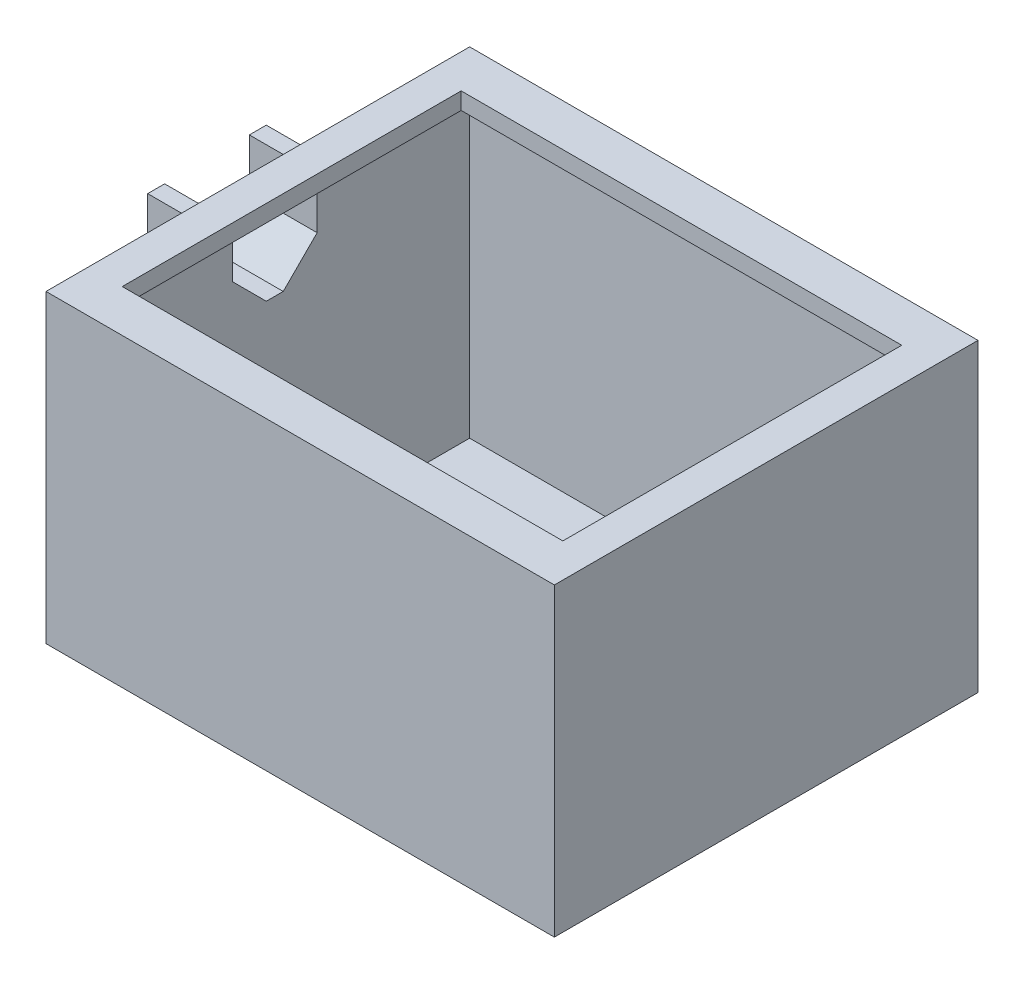
ISO-10303-21;
HEADER;
FILE_DESCRIPTION(('STEP AP214'),'2;1');
FILE_NAME('part.step','',(''),(''),'','','');
FILE_SCHEMA(('AUTOMOTIVE_DESIGN { 1 0 10303 214 1 1 1 1 }'));
ENDSEC;
DATA;
#1=APPLICATION_CONTEXT('core data for automotive mechanical design processes');
#2=APPLICATION_PROTOCOL_DEFINITION('international standard','automotive_design',2000,#1);
#3=PRODUCT_CONTEXT('',#1,'mechanical');
#4=PRODUCT('Part','Part','',(#3));
#5=PRODUCT_RELATED_PRODUCT_CATEGORY('part','',(#4));
#6=PRODUCT_DEFINITION_FORMATION('','',#4);
#7=PRODUCT_DEFINITION_CONTEXT('part definition',#1,'design');
#8=PRODUCT_DEFINITION('design','',#6,#7);
#9=PRODUCT_DEFINITION_SHAPE('','',#8);
#10=(LENGTH_UNIT() NAMED_UNIT(*) SI_UNIT(.MILLI.,.METRE.));
#11=(NAMED_UNIT(*) PLANE_ANGLE_UNIT() SI_UNIT($,.RADIAN.));
#12=(NAMED_UNIT(*) SI_UNIT($,.STERADIAN.) SOLID_ANGLE_UNIT());
#13=UNCERTAINTY_MEASURE_WITH_UNIT(LENGTH_MEASURE(1.E-05),#10,'distance_accuracy_value','');
#14=(GEOMETRIC_REPRESENTATION_CONTEXT(3) GLOBAL_UNCERTAINTY_ASSIGNED_CONTEXT((#13)) GLOBAL_UNIT_ASSIGNED_CONTEXT((#10,
#11,#12)) REPRESENTATION_CONTEXT('',''));
#15=CARTESIAN_POINT('',(0.,0.,0.));
#16=DIRECTION('',(0.,0.,1.));
#17=DIRECTION('',(1.,0.,0.));
#18=AXIS2_PLACEMENT_3D('',#15,#16,#17);
#19=CARTESIAN_POINT('',(-28.,40.,-25.));
#20=DIRECTION('',(1.,0.,0.));
#21=DIRECTION('',(0.,0.,-1.));
#22=AXIS2_PLACEMENT_3D('',#19,#20,#21);
#23=PLANE('',#22);
#24=DIRECTION('',(0.,-1.,0.));
#25=VECTOR('',#24,1.);
#26=CARTESIAN_POINT('',(-28.,40.,-4.99999999999999));
#27=LINE('',#26,#25);
#28=CARTESIAN_POINT('',(-28.,38.,-4.99999999999999));
#29=VERTEX_POINT('',#28);
#30=CARTESIAN_POINT('',(-28.,32.,-4.99999999999999));
#31=VERTEX_POINT('',#30);
#32=EDGE_CURVE('E305',#29,#31,#27,.T.);
#33=ORIENTED_EDGE('',*,*,#32,.T.);
#34=DIRECTION('',(0.,0.707106781186544,-0.707106781186552));
#35=VECTOR('',#34,1.);
#36=CARTESIAN_POINT('',(-28.,28.,-0.999999999999951));
#37=LINE('',#36,#35);
#38=CARTESIAN_POINT('',(-28.,28.,-0.999999999999952));
#39=VERTEX_POINT('',#38);
#40=EDGE_CURVE('E500',#31,#39,#37,.F.);
#41=ORIENTED_EDGE('',*,*,#40,.T.);
#42=DIRECTION('',(0.,0.,1.));
#43=VECTOR('',#42,1.);
#44=CARTESIAN_POINT('',(-28.,28.,-25.));
#45=LINE('',#44,#43);
#46=CARTESIAN_POINT('',(-28.,28.,1.));
#47=VERTEX_POINT('',#46);
#48=EDGE_CURVE('E309',#39,#47,#45,.T.);
#49=ORIENTED_EDGE('',*,*,#48,.T.);
#50=DIRECTION('',(0.,-0.707106781186553,-0.707106781186543));
#51=VECTOR('',#50,1.);
#52=CARTESIAN_POINT('',(-28.,32.0000000000001,5.));
#53=LINE('',#52,#51);
#54=CARTESIAN_POINT('',(-28.,32.0000000000001,5.));
#55=VERTEX_POINT('',#54);
#56=EDGE_CURVE('E11',#47,#55,#53,.F.);
#57=ORIENTED_EDGE('',*,*,#56,.T.);
#58=DIRECTION('',(0.,1.,0.));
#59=VECTOR('',#58,1.);
#60=CARTESIAN_POINT('',(-28.,40.,5.));
#61=LINE('',#60,#59);
#62=CARTESIAN_POINT('',(-28.,38.,5.));
#63=VERTEX_POINT('',#62);
#64=EDGE_CURVE('E312',#55,#63,#61,.T.);
#65=ORIENTED_EDGE('',*,*,#64,.T.);
#66=DIRECTION('',(0.,0.,1.));
#67=VECTOR('',#66,1.);
#68=CARTESIAN_POINT('',(-28.,38.,-25.));
#69=LINE('',#68,#67);
#70=CARTESIAN_POINT('',(-28.,38.,23.));
#71=VERTEX_POINT('',#70);
#72=EDGE_CURVE('E383',#63,#71,#69,.T.);
#73=ORIENTED_EDGE('',*,*,#72,.T.);
#74=DIRECTION('',(0.,-1.,0.));
#75=VECTOR('',#74,1.);
#76=CARTESIAN_POINT('',(-28.,40.,23.));
#77=LINE('',#76,#75);
#78=CARTESIAN_POINT('',(-28.,2.,23.));
#79=VERTEX_POINT('',#78);
#80=EDGE_CURVE('E391',#71,#79,#77,.T.);
#81=ORIENTED_EDGE('',*,*,#80,.T.);
#82=DIRECTION('',(0.,0.,1.));
#83=VECTOR('',#82,1.);
#84=CARTESIAN_POINT('',(-28.,2.,-25.));
#85=LINE('',#84,#83);
#86=CARTESIAN_POINT('',(-28.,2.,-23.));
#87=VERTEX_POINT('',#86);
#88=EDGE_CURVE('E402',#87,#79,#85,.T.);
#89=ORIENTED_EDGE('',*,*,#88,.F.);
#90=DIRECTION('',(0.,-1.,0.));
#91=VECTOR('',#90,1.);
#92=CARTESIAN_POINT('',(-28.,40.,-23.));
#93=LINE('',#92,#91);
#94=CARTESIAN_POINT('',(-28.,38.,-23.));
#95=VERTEX_POINT('',#94);
#96=EDGE_CURVE('E398',#95,#87,#93,.T.);
#97=ORIENTED_EDGE('',*,*,#96,.F.);
#98=EDGE_CURVE('E379',#95,#29,#69,.T.);
#99=ORIENTED_EDGE('',*,*,#98,.T.);
#100=EDGE_LOOP('',(#33,#41,#49,#57,#65,#73,#81,#89,#97,#99));
#101=FACE_BOUND('',#100,.T.);
#102=ADVANCED_FACE('F41',(#101),#23,.T.);
#103=CARTESIAN_POINT('',(-30.,40.,-25.));
#104=DIRECTION('',(1.,0.,0.));
#105=DIRECTION('',(0.,0.,-1.));
#106=AXIS2_PLACEMENT_3D('',#103,#104,#105);
#107=PLANE('',#106);
#108=DIRECTION('',(0.,-1.,0.));
#109=VECTOR('',#108,1.);
#110=CARTESIAN_POINT('',(-30.,40.,-25.));
#111=LINE('',#110,#109);
#112=CARTESIAN_POINT('',(-30.,40.,-25.));
#113=VERTEX_POINT('',#112);
#114=CARTESIAN_POINT('',(-30.,4.00000000000002,-25.));
#115=VERTEX_POINT('',#114);
#116=EDGE_CURVE('E366',#113,#115,#111,.T.);
#117=ORIENTED_EDGE('',*,*,#116,.T.);
#118=DIRECTION('',(0.,0.,1.));
#119=VECTOR('',#118,1.);
#120=CARTESIAN_POINT('',(-30.,4.00000000000002,-25.));
#121=LINE('',#120,#119);
#122=CARTESIAN_POINT('',(-30.,4.00000000000002,25.));
#123=VERTEX_POINT('',#122);
#124=EDGE_CURVE('E456',#115,#123,#121,.T.);
#125=ORIENTED_EDGE('',*,*,#124,.T.);
#126=DIRECTION('',(0.,-1.,0.));
#127=VECTOR('',#126,1.);
#128=CARTESIAN_POINT('',(-30.,40.,25.));
#129=LINE('',#128,#127);
#130=CARTESIAN_POINT('',(-30.,40.,25.));
#131=VERTEX_POINT('',#130);
#132=EDGE_CURVE('E362',#131,#123,#129,.T.);
#133=ORIENTED_EDGE('',*,*,#132,.F.);
#134=DIRECTION('',(0.,0.,1.));
#135=VECTOR('',#134,1.);
#136=CARTESIAN_POINT('',(-30.,40.,-25.));
#137=LINE('',#136,#135);
#138=EDGE_CURVE('E352',#113,#131,#137,.T.);
#139=ORIENTED_EDGE('',*,*,#138,.F.);
#140=EDGE_LOOP('',(#117,#125,#133,#139));
#141=FACE_BOUND('',#140,.T.);
#142=DIRECTION('',(0.,0.,-1.));
#143=VECTOR('',#142,1.);
#144=CARTESIAN_POINT('',(-30.,21.,-25.));
#145=LINE('',#144,#143);
#146=CARTESIAN_POINT('',(-30.,21.,7.00000000000001));
#147=VERTEX_POINT('',#146);
#148=CARTESIAN_POINT('',(-30.,21.,-6.99999999999999));
#149=VERTEX_POINT('',#148);
#150=EDGE_CURVE('E459',#147,#149,#145,.T.);
#151=ORIENTED_EDGE('',*,*,#150,.T.);
#152=DIRECTION('',(0.,1.,0.));
#153=VECTOR('',#152,1.);
#154=CARTESIAN_POINT('',(-30.,26.,-6.99999999999999));
#155=LINE('',#154,#153);
#156=CARTESIAN_POINT('',(-30.,38.,-6.99999999999999));
#157=VERTEX_POINT('',#156);
#158=EDGE_CURVE('E271',#149,#157,#155,.T.);
#159=ORIENTED_EDGE('',*,*,#158,.T.);
#160=DIRECTION('',(0.,0.,1.));
#161=VECTOR('',#160,1.);
#162=CARTESIAN_POINT('',(-30.,38.,-6.99999999999999));
#163=LINE('',#162,#161);
#164=CARTESIAN_POINT('',(-30.,38.,-4.99999999999999));
#165=VERTEX_POINT('',#164);
#166=EDGE_CURVE('E225',#157,#165,#163,.T.);
#167=ORIENTED_EDGE('',*,*,#166,.T.);
#168=DIRECTION('',(0.,0.,1.));
#169=VECTOR('',#168,1.);
#170=CARTESIAN_POINT('',(-30.,38.,-4.99999999999999));
#171=LINE('',#170,#169);
#172=CARTESIAN_POINT('',(-30.,38.,5.));
#173=VERTEX_POINT('',#172);
#174=EDGE_CURVE('E281',#165,#173,#171,.T.);
#175=ORIENTED_EDGE('',*,*,#174,.T.);
#176=DIRECTION('',(0.,0.,1.));
#177=VECTOR('',#176,1.);
#178=CARTESIAN_POINT('',(-30.,38.,5.));
#179=LINE('',#178,#177);
#180=CARTESIAN_POINT('',(-30.,38.,7.00000000000001));
#181=VERTEX_POINT('',#180);
#182=EDGE_CURVE('E231',#173,#181,#179,.T.);
#183=ORIENTED_EDGE('',*,*,#182,.T.);
#184=DIRECTION('',(0.,-1.,0.));
#185=VECTOR('',#184,1.);
#186=CARTESIAN_POINT('',(-30.,38.,7.00000000000001));
#187=LINE('',#186,#185);
#188=EDGE_CURVE('E268',#181,#147,#187,.T.);
#189=ORIENTED_EDGE('',*,*,#188,.T.);
#190=EDGE_LOOP('',(#151,#159,#167,#175,#183,#189));
#191=FACE_BOUND('',#190,.T.);
#192=ADVANCED_FACE('F516',(#141,#191),#107,.F.);
#193=CARTESIAN_POINT('',(28.,40.,-25.));
#194=DIRECTION('',(-1.,0.,0.));
#195=DIRECTION('',(0.,0.,1.));
#196=AXIS2_PLACEMENT_3D('',#193,#194,#195);
#197=PLANE('',#196);
#198=DIRECTION('',(0.,0.,-1.));
#199=VECTOR('',#198,1.);
#200=CARTESIAN_POINT('',(28.,2.,-25.));
#201=LINE('',#200,#199);
#202=CARTESIAN_POINT('',(28.,2.,23.));
#203=VERTEX_POINT('',#202);
#204=CARTESIAN_POINT('',(28.,2.,-23.));
#205=VERTEX_POINT('',#204);
#206=EDGE_CURVE('E374',#203,#205,#201,.T.);
#207=ORIENTED_EDGE('',*,*,#206,.F.);
#208=DIRECTION('',(0.,-1.,0.));
#209=VECTOR('',#208,1.);
#210=CARTESIAN_POINT('',(28.,40.,23.));
#211=LINE('',#210,#209);
#212=CARTESIAN_POINT('',(28.,38.,23.));
#213=VERTEX_POINT('',#212);
#214=EDGE_CURVE('E412',#213,#203,#211,.T.);
#215=ORIENTED_EDGE('',*,*,#214,.F.);
#216=DIRECTION('',(0.,0.,-1.));
#217=VECTOR('',#216,1.);
#218=CARTESIAN_POINT('',(28.,38.,-25.));
#219=LINE('',#218,#217);
#220=CARTESIAN_POINT('',(28.,38.,-23.));
#221=VERTEX_POINT('',#220);
#222=EDGE_CURVE('E387',#213,#221,#219,.T.);
#223=ORIENTED_EDGE('',*,*,#222,.T.);
#224=DIRECTION('',(0.,-1.,0.));
#225=VECTOR('',#224,1.);
#226=CARTESIAN_POINT('',(28.,40.,-23.));
#227=LINE('',#226,#225);
#228=EDGE_CURVE('E405',#221,#205,#227,.T.);
#229=ORIENTED_EDGE('',*,*,#228,.T.);
#230=EDGE_LOOP('',(#207,#215,#223,#229));
#231=FACE_BOUND('',#230,.T.);
#232=ADVANCED_FACE('F523',(#231),#197,.T.);
#233=CARTESIAN_POINT('',(-30.,40.,-23.));
#234=DIRECTION('',(0.,0.,1.));
#235=DIRECTION('',(1.,0.,0.));
#236=AXIS2_PLACEMENT_3D('',#233,#234,#235);
#237=PLANE('',#236);
#238=DIRECTION('',(-1.,0.,0.));
#239=VECTOR('',#238,1.);
#240=CARTESIAN_POINT('',(-30.,2.,-23.));
#241=LINE('',#240,#239);
#242=EDGE_CURVE('E409',#205,#87,#241,.T.);
#243=ORIENTED_EDGE('',*,*,#242,.F.);
#244=ORIENTED_EDGE('',*,*,#228,.F.);
#245=DIRECTION('',(-1.,0.,0.));
#246=VECTOR('',#245,1.);
#247=CARTESIAN_POINT('',(-30.,38.,-23.));
#248=LINE('',#247,#246);
#249=EDGE_CURVE('E384',#221,#95,#248,.T.);
#250=ORIENTED_EDGE('',*,*,#249,.T.);
#251=ORIENTED_EDGE('',*,*,#96,.T.);
#252=EDGE_LOOP('',(#243,#244,#250,#251));
#253=FACE_BOUND('',#252,.T.);
#254=ADVANCED_FACE('F528',(#253),#237,.T.);
#255=CARTESIAN_POINT('',(-30.,40.,23.));
#256=DIRECTION('',(0.,0.,-1.));
#257=DIRECTION('',(-1.,0.,0.));
#258=AXIS2_PLACEMENT_3D('',#255,#256,#257);
#259=PLANE('',#258);
#260=DIRECTION('',(1.,0.,0.));
#261=VECTOR('',#260,1.);
#262=CARTESIAN_POINT('',(-30.,2.,23.));
#263=LINE('',#262,#261);
#264=EDGE_CURVE('E395',#79,#203,#263,.T.);
#265=ORIENTED_EDGE('',*,*,#264,.F.);
#266=ORIENTED_EDGE('',*,*,#80,.F.);
#267=DIRECTION('',(1.,0.,0.));
#268=VECTOR('',#267,1.);
#269=CARTESIAN_POINT('',(-30.,38.,23.));
#270=LINE('',#269,#268);
#271=EDGE_CURVE('E375',#71,#213,#270,.T.);
#272=ORIENTED_EDGE('',*,*,#271,.T.);
#273=ORIENTED_EDGE('',*,*,#214,.T.);
#274=EDGE_LOOP('',(#265,#266,#272,#273));
#275=FACE_BOUND('',#274,.T.);
#276=ADVANCED_FACE('F530',(#275),#259,.T.);
#277=CARTESIAN_POINT('',(0.,38.,0.));
#278=DIRECTION('',(0.,1.,0.));
#279=DIRECTION('',(0.,0.,1.));
#280=AXIS2_PLACEMENT_3D('',#277,#278,#279);
#281=PLANE('',#280);
#282=ORIENTED_EDGE('',*,*,#72,.F.);
#283=DIRECTION('',(-1.,0.,0.));
#284=VECTOR('',#283,1.);
#285=CARTESIAN_POINT('',(-25.,38.,5.));
#286=LINE('',#285,#284);
#287=EDGE_CURVE('E298',#63,#173,#286,.T.);
#288=ORIENTED_EDGE('',*,*,#287,.T.);
#289=ORIENTED_EDGE('',*,*,#174,.F.);
#290=DIRECTION('',(-1.,0.,0.));
#291=VECTOR('',#290,1.);
#292=CARTESIAN_POINT('',(-25.,38.,-5.));
#293=LINE('',#292,#291);
#294=EDGE_CURVE('E301',#29,#165,#293,.T.);
#295=ORIENTED_EDGE('',*,*,#294,.F.);
#296=ORIENTED_EDGE('',*,*,#98,.F.);
#297=ORIENTED_EDGE('',*,*,#249,.F.);
#298=ORIENTED_EDGE('',*,*,#222,.F.);
#299=ORIENTED_EDGE('',*,*,#271,.F.);
#300=EDGE_LOOP('',(#282,#288,#289,#295,#296,#297,#298,#299));
#301=FACE_BOUND('',#300,.T.);
#302=DIRECTION('',(0.,0.,1.));
#303=VECTOR('',#302,1.);
#304=CARTESIAN_POINT('',(-26.,38.,0.));
#305=LINE('',#304,#303);
#306=CARTESIAN_POINT('',(-26.,38.,-20.));
#307=VERTEX_POINT('',#306);
#308=CARTESIAN_POINT('',(-26.,38.,20.));
#309=VERTEX_POINT('',#308);
#310=EDGE_CURVE('E422',#307,#309,#305,.T.);
#311=ORIENTED_EDGE('',*,*,#310,.T.);
#312=DIRECTION('',(1.,0.,0.));
#313=VECTOR('',#312,1.);
#314=CARTESIAN_POINT('',(0.,38.,20.));
#315=LINE('',#314,#313);
#316=CARTESIAN_POINT('',(26.,38.,20.));
#317=VERTEX_POINT('',#316);
#318=EDGE_CURVE('E425',#309,#317,#315,.T.);
#319=ORIENTED_EDGE('',*,*,#318,.T.);
#320=DIRECTION('',(0.,0.,-1.));
#321=VECTOR('',#320,1.);
#322=CARTESIAN_POINT('',(26.,38.,0.));
#323=LINE('',#322,#321);
#324=CARTESIAN_POINT('',(26.,38.,-20.));
#325=VERTEX_POINT('',#324);
#326=EDGE_CURVE('E429',#317,#325,#323,.T.);
#327=ORIENTED_EDGE('',*,*,#326,.T.);
#328=DIRECTION('',(-1.,0.,0.));
#329=VECTOR('',#328,1.);
#330=CARTESIAN_POINT('',(0.,38.,-20.));
#331=LINE('',#330,#329);
#332=EDGE_CURVE('E378',#325,#307,#331,.T.);
#333=ORIENTED_EDGE('',*,*,#332,.T.);
#334=EDGE_LOOP('',(#311,#319,#327,#333));
#335=FACE_BOUND('',#334,.T.);
#336=ADVANCED_FACE('F533',(#301,#335),#281,.F.);
#337=CARTESIAN_POINT('',(0.,2.,0.));
#338=DIRECTION('',(0.,1.,0.));
#339=DIRECTION('',(0.,0.,1.));
#340=AXIS2_PLACEMENT_3D('',#337,#338,#339);
#341=PLANE('',#340);
#342=ORIENTED_EDGE('',*,*,#206,.T.);
#343=ORIENTED_EDGE('',*,*,#242,.T.);
#344=ORIENTED_EDGE('',*,*,#88,.T.);
#345=ORIENTED_EDGE('',*,*,#264,.T.);
#346=EDGE_LOOP('',(#342,#343,#344,#345));
#347=FACE_BOUND('',#346,.T.);
#348=ADVANCED_FACE('F537',(#347),#341,.T.);
#349=CARTESIAN_POINT('',(26.,30.,-20.));
#350=DIRECTION('',(1.,0.,0.));
#351=DIRECTION('',(0.,0.,-1.));
#352=AXIS2_PLACEMENT_3D('',#349,#350,#351);
#353=PLANE('',#352);
#354=DIRECTION('',(0.,1.,0.));
#355=VECTOR('',#354,1.);
#356=CARTESIAN_POINT('',(26.,30.,20.));
#357=LINE('',#356,#355);
#358=CARTESIAN_POINT('',(26.,40.,20.));
#359=VERTEX_POINT('',#358);
#360=EDGE_CURVE('E333',#317,#359,#357,.T.);
#361=ORIENTED_EDGE('',*,*,#360,.T.);
#362=DIRECTION('',(0.,0.,-1.));
#363=VECTOR('',#362,1.);
#364=CARTESIAN_POINT('',(26.,40.,-20.));
#365=LINE('',#364,#363);
#366=CARTESIAN_POINT('',(26.,40.,-20.));
#367=VERTEX_POINT('',#366);
#368=EDGE_CURVE('E316',#359,#367,#365,.T.);
#369=ORIENTED_EDGE('',*,*,#368,.T.);
#370=DIRECTION('',(0.,1.,0.));
#371=VECTOR('',#370,1.);
#372=CARTESIAN_POINT('',(26.,30.,-20.));
#373=LINE('',#372,#371);
#374=EDGE_CURVE('E332',#325,#367,#373,.T.);
#375=ORIENTED_EDGE('',*,*,#374,.F.);
#376=ORIENTED_EDGE('',*,*,#326,.F.);
#377=EDGE_LOOP('',(#361,#369,#375,#376));
#378=FACE_BOUND('',#377,.T.);
#379=ADVANCED_FACE('F541',(#378),#353,.F.);
#380=CARTESIAN_POINT('',(-26.,30.,20.));
#381=DIRECTION('',(0.,0.,1.));
#382=DIRECTION('',(1.,0.,0.));
#383=AXIS2_PLACEMENT_3D('',#380,#381,#382);
#384=PLANE('',#383);
#385=DIRECTION('',(0.,1.,0.));
#386=VECTOR('',#385,1.);
#387=CARTESIAN_POINT('',(-26.,30.,20.));
#388=LINE('',#387,#386);
#389=CARTESIAN_POINT('',(-26.,40.,20.));
#390=VERTEX_POINT('',#389);
#391=EDGE_CURVE('E337',#309,#390,#388,.T.);
#392=ORIENTED_EDGE('',*,*,#391,.T.);
#393=DIRECTION('',(1.,0.,0.));
#394=VECTOR('',#393,1.);
#395=CARTESIAN_POINT('',(-26.,40.,20.));
#396=LINE('',#395,#394);
#397=EDGE_CURVE('E328',#390,#359,#396,.T.);
#398=ORIENTED_EDGE('',*,*,#397,.T.);
#399=ORIENTED_EDGE('',*,*,#360,.F.);
#400=ORIENTED_EDGE('',*,*,#318,.F.);
#401=EDGE_LOOP('',(#392,#398,#399,#400));
#402=FACE_BOUND('',#401,.T.);
#403=ADVANCED_FACE('F643',(#402),#384,.F.);
#404=CARTESIAN_POINT('',(-26.,30.,-20.));
#405=DIRECTION('',(-1.,0.,0.));
#406=DIRECTION('',(0.,0.,1.));
#407=AXIS2_PLACEMENT_3D('',#404,#405,#406);
#408=PLANE('',#407);
#409=DIRECTION('',(0.,1.,0.));
#410=VECTOR('',#409,1.);
#411=CARTESIAN_POINT('',(-26.,30.,-20.));
#412=LINE('',#411,#410);
#413=CARTESIAN_POINT('',(-26.,40.,-20.));
#414=VERTEX_POINT('',#413);
#415=EDGE_CURVE('E340',#307,#414,#412,.T.);
#416=ORIENTED_EDGE('',*,*,#415,.T.);
#417=DIRECTION('',(0.,0.,1.));
#418=VECTOR('',#417,1.);
#419=CARTESIAN_POINT('',(-26.,40.,-20.));
#420=LINE('',#419,#418);
#421=EDGE_CURVE('E324',#414,#390,#420,.T.);
#422=ORIENTED_EDGE('',*,*,#421,.T.);
#423=ORIENTED_EDGE('',*,*,#391,.F.);
#424=ORIENTED_EDGE('',*,*,#310,.F.);
#425=EDGE_LOOP('',(#416,#422,#423,#424));
#426=FACE_BOUND('',#425,.T.);
#427=ADVANCED_FACE('F646',(#426),#408,.F.);
#428=CARTESIAN_POINT('',(-26.,30.,-20.));
#429=DIRECTION('',(0.,0.,-1.));
#430=DIRECTION('',(-1.,0.,0.));
#431=AXIS2_PLACEMENT_3D('',#428,#429,#430);
#432=PLANE('',#431);
#433=ORIENTED_EDGE('',*,*,#374,.T.);
#434=DIRECTION('',(-1.,0.,0.));
#435=VECTOR('',#434,1.);
#436=CARTESIAN_POINT('',(-26.,40.,-20.));
#437=LINE('',#436,#435);
#438=EDGE_CURVE('E319',#367,#414,#437,.T.);
#439=ORIENTED_EDGE('',*,*,#438,.T.);
#440=ORIENTED_EDGE('',*,*,#415,.F.);
#441=ORIENTED_EDGE('',*,*,#332,.F.);
#442=EDGE_LOOP('',(#433,#439,#440,#441));
#443=FACE_BOUND('',#442,.T.);
#444=ADVANCED_FACE('F650',(#443),#432,.F.);
#445=CARTESIAN_POINT('',(30.,40.,-25.));
#446=DIRECTION('',(-1.,0.,0.));
#447=DIRECTION('',(0.,0.,1.));
#448=AXIS2_PLACEMENT_3D('',#445,#446,#447);
#449=PLANE('',#448);
#450=DIRECTION('',(0.,-1.,0.));
#451=VECTOR('',#450,1.);
#452=CARTESIAN_POINT('',(30.,40.,25.));
#453=LINE('',#452,#451);
#454=CARTESIAN_POINT('',(30.,40.,25.));
#455=VERTEX_POINT('',#454);
#456=CARTESIAN_POINT('',(30.,4.00000000000002,25.));
#457=VERTEX_POINT('',#456);
#458=EDGE_CURVE('E358',#455,#457,#453,.T.);
#459=ORIENTED_EDGE('',*,*,#458,.T.);
#460=DIRECTION('',(0.,0.,-1.));
#461=VECTOR('',#460,1.);
#462=CARTESIAN_POINT('',(30.,4.00000000000002,-25.));
#463=LINE('',#462,#461);
#464=CARTESIAN_POINT('',(30.,4.00000000000002,-25.));
#465=VERTEX_POINT('',#464);
#466=EDGE_CURVE('E450',#457,#465,#463,.T.);
#467=ORIENTED_EDGE('',*,*,#466,.T.);
#468=DIRECTION('',(0.,-1.,0.));
#469=VECTOR('',#468,1.);
#470=CARTESIAN_POINT('',(30.,40.,-25.));
#471=LINE('',#470,#469);
#472=CARTESIAN_POINT('',(30.,40.,-25.));
#473=VERTEX_POINT('',#472);
#474=EDGE_CURVE('E370',#473,#465,#471,.T.);
#475=ORIENTED_EDGE('',*,*,#474,.F.);
#476=DIRECTION('',(0.,0.,-1.));
#477=VECTOR('',#476,1.);
#478=CARTESIAN_POINT('',(30.,40.,-25.));
#479=LINE('',#478,#477);
#480=EDGE_CURVE('E336',#455,#473,#479,.T.);
#481=ORIENTED_EDGE('',*,*,#480,.F.);
#482=EDGE_LOOP('',(#459,#467,#475,#481));
#483=FACE_BOUND('',#482,.T.);
#484=ADVANCED_FACE('F654',(#483),#449,.F.);
#485=CARTESIAN_POINT('',(-30.,40.,-25.));
#486=DIRECTION('',(0.,0.,1.));
#487=DIRECTION('',(1.,0.,0.));
#488=AXIS2_PLACEMENT_3D('',#485,#486,#487);
#489=PLANE('',#488);
#490=ORIENTED_EDGE('',*,*,#474,.T.);
#491=DIRECTION('',(-1.,0.,0.));
#492=VECTOR('',#491,1.);
#493=CARTESIAN_POINT('',(-30.,4.00000000000002,-25.));
#494=LINE('',#493,#492);
#495=EDGE_CURVE('E433',#465,#115,#494,.T.);
#496=ORIENTED_EDGE('',*,*,#495,.T.);
#497=ORIENTED_EDGE('',*,*,#116,.F.);
#498=DIRECTION('',(-1.,0.,0.));
#499=VECTOR('',#498,1.);
#500=CARTESIAN_POINT('',(-30.,40.,-25.));
#501=LINE('',#500,#499);
#502=EDGE_CURVE('E349',#473,#113,#501,.T.);
#503=ORIENTED_EDGE('',*,*,#502,.F.);
#504=EDGE_LOOP('',(#490,#496,#497,#503));
#505=FACE_BOUND('',#504,.T.);
#506=ADVANCED_FACE('F668',(#505),#489,.F.);
#507=CARTESIAN_POINT('',(-30.,40.,25.));
#508=DIRECTION('',(0.,0.,-1.));
#509=DIRECTION('',(-1.,0.,0.));
#510=AXIS2_PLACEMENT_3D('',#507,#508,#509);
#511=PLANE('',#510);
#512=ORIENTED_EDGE('',*,*,#132,.T.);
#513=DIRECTION('',(1.,0.,0.));
#514=VECTOR('',#513,1.);
#515=CARTESIAN_POINT('',(-30.,4.00000000000002,25.));
#516=LINE('',#515,#514);
#517=EDGE_CURVE('E453',#123,#457,#516,.T.);
#518=ORIENTED_EDGE('',*,*,#517,.T.);
#519=ORIENTED_EDGE('',*,*,#458,.F.);
#520=DIRECTION('',(1.,0.,0.));
#521=VECTOR('',#520,1.);
#522=CARTESIAN_POINT('',(-30.,40.,25.));
#523=LINE('',#522,#521);
#524=EDGE_CURVE('E355',#131,#455,#523,.T.);
#525=ORIENTED_EDGE('',*,*,#524,.F.);
#526=EDGE_LOOP('',(#512,#518,#519,#525));
#527=FACE_BOUND('',#526,.T.);
#528=ADVANCED_FACE('F662',(#527),#511,.F.);
#529=CARTESIAN_POINT('',(0.,40.,0.));
#530=DIRECTION('',(0.,1.,0.));
#531=DIRECTION('',(0.,0.,1.));
#532=AXIS2_PLACEMENT_3D('',#529,#530,#531);
#533=PLANE('',#532);
#534=ORIENTED_EDGE('',*,*,#368,.F.);
#535=ORIENTED_EDGE('',*,*,#397,.F.);
#536=ORIENTED_EDGE('',*,*,#421,.F.);
#537=ORIENTED_EDGE('',*,*,#438,.F.);
#538=EDGE_LOOP('',(#534,#535,#536,#537));
#539=FACE_BOUND('',#538,.T.);
#540=ORIENTED_EDGE('',*,*,#480,.T.);
#541=ORIENTED_EDGE('',*,*,#502,.T.);
#542=ORIENTED_EDGE('',*,*,#138,.T.);
#543=ORIENTED_EDGE('',*,*,#524,.T.);
#544=EDGE_LOOP('',(#540,#541,#542,#543));
#545=FACE_BOUND('',#544,.T.);
#546=ADVANCED_FACE('F659',(#539,#545),#533,.T.);
#547=CARTESIAN_POINT('',(0.,0.,0.));
#548=DIRECTION('',(0.,1.,0.));
#549=DIRECTION('',(0.,0.,1.));
#550=AXIS2_PLACEMENT_3D('',#547,#548,#549);
#551=PLANE('',#550);
#552=DIRECTION('',(0.,0.,-1.));
#553=VECTOR('',#552,1.);
#554=CARTESIAN_POINT('',(-26.,0.,0.));
#555=LINE('',#554,#553);
#556=CARTESIAN_POINT('',(-26.,0.,21.));
#557=VERTEX_POINT('',#556);
#558=CARTESIAN_POINT('',(-26.,0.,-21.));
#559=VERTEX_POINT('',#558);
#560=EDGE_CURVE('E437',#557,#559,#555,.T.);
#561=ORIENTED_EDGE('',*,*,#560,.T.);
#562=DIRECTION('',(1.,0.,0.));
#563=VECTOR('',#562,1.);
#564=CARTESIAN_POINT('',(0.,0.,-21.));
#565=LINE('',#564,#563);
#566=CARTESIAN_POINT('',(26.,0.,-21.));
#567=VERTEX_POINT('',#566);
#568=EDGE_CURVE('E446',#559,#567,#565,.T.);
#569=ORIENTED_EDGE('',*,*,#568,.T.);
#570=DIRECTION('',(0.,0.,1.));
#571=VECTOR('',#570,1.);
#572=CARTESIAN_POINT('',(26.,0.,0.));
#573=LINE('',#572,#571);
#574=CARTESIAN_POINT('',(26.,0.,21.));
#575=VERTEX_POINT('',#574);
#576=EDGE_CURVE('E443',#567,#575,#573,.T.);
#577=ORIENTED_EDGE('',*,*,#576,.T.);
#578=DIRECTION('',(-1.,0.,0.));
#579=VECTOR('',#578,1.);
#580=CARTESIAN_POINT('',(0.,0.,21.));
#581=LINE('',#580,#579);
#582=EDGE_CURVE('E440',#575,#557,#581,.T.);
#583=ORIENTED_EDGE('',*,*,#582,.T.);
#584=EDGE_LOOP('',(#561,#569,#577,#583));
#585=FACE_BOUND('',#584,.T.);
#586=ADVANCED_FACE('F571',(#585),#551,.F.);
#587=CARTESIAN_POINT('',(-30.,4.00000000000002,25.));
#588=DIRECTION('',(0.,0.707106781186548,-0.707106781186547));
#589=DIRECTION('',(1.,0.,0.));
#590=AXIS2_PLACEMENT_3D('',#587,#588,#589);
#591=PLANE('',#590);
#592=DIRECTION('',(-0.577350269189626,0.577350269189625,0.577350269189626));
#593=VECTOR('',#592,1.);
#594=CARTESIAN_POINT('',(-13.3333333333333,-12.6666666666666,8.33333333333332));
#595=LINE('',#594,#593);
#596=EDGE_CURVE('E465',#557,#123,#595,.T.);
#597=ORIENTED_EDGE('',*,*,#596,.F.);
#598=ORIENTED_EDGE('',*,*,#582,.F.);
#599=DIRECTION('',(0.577350269189626,0.577350269189625,0.577350269189626));
#600=VECTOR('',#599,1.);
#601=CARTESIAN_POINT('',(9.99999999999999,-16.,4.99999999999998));
#602=LINE('',#601,#600);
#603=EDGE_CURVE('E320',#457,#575,#602,.F.);
#604=ORIENTED_EDGE('',*,*,#603,.F.);
#605=ORIENTED_EDGE('',*,*,#517,.F.);
#606=EDGE_LOOP('',(#597,#598,#604,#605));
#607=FACE_BOUND('',#606,.T.);
#608=ADVANCED_FACE('F565',(#607),#591,.F.);
#609=CARTESIAN_POINT('',(30.,4.00000000000002,-25.));
#610=DIRECTION('',(-0.707106781186547,0.707106781186548,0.));
#611=DIRECTION('',(0.,0.,-1.));
#612=AXIS2_PLACEMENT_3D('',#609,#610,#611);
#613=PLANE('',#612);
#614=ORIENTED_EDGE('',*,*,#603,.T.);
#615=ORIENTED_EDGE('',*,*,#576,.F.);
#616=DIRECTION('',(0.577350269189626,0.577350269189625,-0.577350269189626));
#617=VECTOR('',#616,1.);
#618=CARTESIAN_POINT('',(30.,4.00000000000002,-25.));
#619=LINE('',#618,#617);
#620=EDGE_CURVE('E462',#465,#567,#619,.F.);
#621=ORIENTED_EDGE('',*,*,#620,.F.);
#622=ORIENTED_EDGE('',*,*,#466,.F.);
#623=EDGE_LOOP('',(#614,#615,#621,#622));
#624=FACE_BOUND('',#623,.T.);
#625=ADVANCED_FACE('F558',(#624),#613,.F.);
#626=CARTESIAN_POINT('',(-30.,4.00000000000002,-25.));
#627=DIRECTION('',(0.707106781186547,0.707106781186548,0.));
#628=DIRECTION('',(0.,0.,1.));
#629=AXIS2_PLACEMENT_3D('',#626,#627,#628);
#630=PLANE('',#629);
#631=ORIENTED_EDGE('',*,*,#596,.T.);
#632=ORIENTED_EDGE('',*,*,#124,.F.);
#633=DIRECTION('',(0.577350269189626,-0.577350269189625,0.577350269189626));
#634=VECTOR('',#633,1.);
#635=CARTESIAN_POINT('',(-30.,4.00000000000002,-25.));
#636=LINE('',#635,#634);
#637=EDGE_CURVE('E315',#559,#115,#636,.F.);
#638=ORIENTED_EDGE('',*,*,#637,.F.);
#639=ORIENTED_EDGE('',*,*,#560,.F.);
#640=EDGE_LOOP('',(#631,#632,#638,#639));
#641=FACE_BOUND('',#640,.T.);
#642=ADVANCED_FACE('F551',(#641),#630,.F.);
#643=CARTESIAN_POINT('',(-30.,4.00000000000002,-25.));
#644=DIRECTION('',(0.,0.707106781186548,0.707106781186547));
#645=DIRECTION('',(-1.,0.,0.));
#646=AXIS2_PLACEMENT_3D('',#643,#644,#645);
#647=PLANE('',#646);
#648=ORIENTED_EDGE('',*,*,#620,.T.);
#649=ORIENTED_EDGE('',*,*,#568,.F.);
#650=ORIENTED_EDGE('',*,*,#637,.T.);
#651=ORIENTED_EDGE('',*,*,#495,.F.);
#652=EDGE_LOOP('',(#648,#649,#650,#651));
#653=FACE_BOUND('',#652,.T.);
#654=ADVANCED_FACE('F544',(#653),#647,.F.);
#655=CARTESIAN_POINT('',(-25.,38.,5.));
#656=DIRECTION('',(0.,0.,-1.));
#657=DIRECTION('',(-1.,0.,0.));
#658=AXIS2_PLACEMENT_3D('',#655,#656,#657);
#659=PLANE('',#658);
#660=ORIENTED_EDGE('',*,*,#64,.F.);
#661=DIRECTION('',(-1.,0.,0.));
#662=VECTOR('',#661,1.);
#663=CARTESIAN_POINT('',(-36.,32.0000000000001,5.00000000000001));
#664=LINE('',#663,#662);
#665=CARTESIAN_POINT('',(-36.,32.0000000000001,5.00000000000001));
#666=VERTEX_POINT('',#665);
#667=EDGE_CURVE('E220',#55,#666,#664,.T.);
#668=ORIENTED_EDGE('',*,*,#667,.T.);
#669=DIRECTION('',(0.,1.,0.));
#670=VECTOR('',#669,1.);
#671=CARTESIAN_POINT('',(-36.,28.,5.00000000000001));
#672=LINE('',#671,#670);
#673=CARTESIAN_POINT('',(-36.,38.,5.00000000000001));
#674=VERTEX_POINT('',#673);
#675=EDGE_CURVE('E214',#666,#674,#672,.T.);
#676=ORIENTED_EDGE('',*,*,#675,.T.);
#677=DIRECTION('',(1.,0.,0.));
#678=VECTOR('',#677,1.);
#679=CARTESIAN_POINT('',(-36.,38.,5.00000000000001));
#680=LINE('',#679,#678);
#681=EDGE_CURVE('E218',#674,#173,#680,.T.);
#682=ORIENTED_EDGE('',*,*,#681,.T.);
#683=ORIENTED_EDGE('',*,*,#287,.F.);
#684=EDGE_LOOP('',(#660,#668,#676,#682,#683));
#685=FACE_BOUND('',#684,.T.);
#686=ADVANCED_FACE('F216',(#685),#659,.T.);
#687=CARTESIAN_POINT('',(-25.,28.,-5.));
#688=DIRECTION('',(0.,1.,0.));
#689=DIRECTION('',(0.,0.,1.));
#690=AXIS2_PLACEMENT_3D('',#687,#688,#689);
#691=PLANE('',#690);
#692=ORIENTED_EDGE('',*,*,#48,.F.);
#693=DIRECTION('',(-1.,0.,0.));
#694=VECTOR('',#693,1.);
#695=CARTESIAN_POINT('',(-36.,28.,-0.999999999999949));
#696=LINE('',#695,#694);
#697=CARTESIAN_POINT('',(-36.,28.,-0.99999999999995));
#698=VERTEX_POINT('',#697);
#699=EDGE_CURVE('E488',#39,#698,#696,.T.);
#700=ORIENTED_EDGE('',*,*,#699,.T.);
#701=DIRECTION('',(0.,0.,1.));
#702=VECTOR('',#701,1.);
#703=CARTESIAN_POINT('',(-36.,28.,-4.99999999999999));
#704=LINE('',#703,#702);
#705=CARTESIAN_POINT('',(-36.,28.,1.));
#706=VERTEX_POINT('',#705);
#707=EDGE_CURVE('E235',#698,#706,#704,.T.);
#708=ORIENTED_EDGE('',*,*,#707,.T.);
#709=DIRECTION('',(1.,0.,0.));
#710=VECTOR('',#709,1.);
#711=CARTESIAN_POINT('',(-28.,28.,1.));
#712=LINE('',#711,#710);
#713=EDGE_CURVE('E485',#706,#47,#712,.T.);
#714=ORIENTED_EDGE('',*,*,#713,.T.);
#715=EDGE_LOOP('',(#692,#700,#708,#714));
#716=FACE_BOUND('',#715,.T.);
#717=ADVANCED_FACE('F506',(#716),#691,.T.);
#718=CARTESIAN_POINT('',(-25.,38.,-5.));
#719=DIRECTION('',(0.,0.,1.));
#720=DIRECTION('',(1.,0.,0.));
#721=AXIS2_PLACEMENT_3D('',#718,#719,#720);
#722=PLANE('',#721);
#723=DIRECTION('',(0.,-1.,0.));
#724=VECTOR('',#723,1.);
#725=CARTESIAN_POINT('',(-36.,38.,-4.99999999999999));
#726=LINE('',#725,#724);
#727=CARTESIAN_POINT('',(-36.,38.,-4.99999999999999));
#728=VERTEX_POINT('',#727);
#729=CARTESIAN_POINT('',(-36.,32.,-4.99999999999999));
#730=VERTEX_POINT('',#729);
#731=EDGE_CURVE('E259',#728,#730,#726,.T.);
#732=ORIENTED_EDGE('',*,*,#731,.T.);
#733=DIRECTION('',(1.,0.,0.));
#734=VECTOR('',#733,1.);
#735=CARTESIAN_POINT('',(-28.,32.,-5.));
#736=LINE('',#735,#734);
#737=EDGE_CURVE('E492',#730,#31,#736,.T.);
#738=ORIENTED_EDGE('',*,*,#737,.T.);
#739=ORIENTED_EDGE('',*,*,#32,.F.);
#740=ORIENTED_EDGE('',*,*,#294,.T.);
#741=DIRECTION('',(1.,0.,0.));
#742=VECTOR('',#741,1.);
#743=CARTESIAN_POINT('',(-36.,38.,-4.99999999999999));
#744=LINE('',#743,#742);
#745=EDGE_CURVE('E278',#728,#165,#744,.T.);
#746=ORIENTED_EDGE('',*,*,#745,.F.);
#747=EDGE_LOOP('',(#732,#738,#739,#740,#746));
#748=FACE_BOUND('',#747,.T.);
#749=ADVANCED_FACE('F621',(#748),#722,.T.);
#750=CARTESIAN_POINT('',(-36.,38.,-6.99999999999999));
#751=DIRECTION('',(0.,1.,0.));
#752=DIRECTION('',(0.,0.,1.));
#753=AXIS2_PLACEMENT_3D('',#750,#751,#752);
#754=PLANE('',#753);
#755=ORIENTED_EDGE('',*,*,#166,.F.);
#756=DIRECTION('',(1.,0.,0.));
#757=VECTOR('',#756,1.);
#758=CARTESIAN_POINT('',(-36.,38.,-6.99999999999999));
#759=LINE('',#758,#757);
#760=CARTESIAN_POINT('',(-36.,38.,-6.99999999999999));
#761=VERTEX_POINT('',#760);
#762=EDGE_CURVE('E282',#761,#157,#759,.T.);
#763=ORIENTED_EDGE('',*,*,#762,.F.);
#764=DIRECTION('',(0.,0.,1.));
#765=VECTOR('',#764,1.);
#766=CARTESIAN_POINT('',(-36.,38.,-6.99999999999999));
#767=LINE('',#766,#765);
#768=EDGE_CURVE('E255',#761,#728,#767,.T.);
#769=ORIENTED_EDGE('',*,*,#768,.T.);
#770=ORIENTED_EDGE('',*,*,#745,.T.);
#771=EDGE_LOOP('',(#755,#763,#769,#770));
#772=FACE_BOUND('',#771,.T.);
#773=ADVANCED_FACE('F623',(#772),#754,.T.);
#774=CARTESIAN_POINT('',(-36.,26.,-6.99999999999999));
#775=DIRECTION('',(0.,0.,-1.));
#776=DIRECTION('',(-1.,0.,0.));
#777=AXIS2_PLACEMENT_3D('',#774,#775,#776);
#778=PLANE('',#777);
#779=ORIENTED_EDGE('',*,*,#158,.F.);
#780=DIRECTION('',(-0.707106781186544,0.707106781186551,0.));
#781=VECTOR('',#780,1.);
#782=CARTESIAN_POINT('',(-30.,21.,-6.99999999999999));
#783=LINE('',#782,#781);
#784=CARTESIAN_POINT('',(-35.,26.,-6.99999999999999));
#785=VERTEX_POINT('',#784);
#786=EDGE_CURVE('E478',#149,#785,#783,.T.);
#787=ORIENTED_EDGE('',*,*,#786,.T.);
#788=DIRECTION('',(1.,0.,0.));
#789=VECTOR('',#788,1.);
#790=CARTESIAN_POINT('',(-36.,26.,-6.99999999999999));
#791=LINE('',#790,#789);
#792=CARTESIAN_POINT('',(-36.,26.,-6.99999999999999));
#793=VERTEX_POINT('',#792);
#794=EDGE_CURVE('E285',#793,#785,#791,.T.);
#795=ORIENTED_EDGE('',*,*,#794,.F.);
#796=DIRECTION('',(0.,1.,0.));
#797=VECTOR('',#796,1.);
#798=CARTESIAN_POINT('',(-36.,26.,-6.99999999999999));
#799=LINE('',#798,#797);
#800=EDGE_CURVE('E251',#793,#761,#799,.T.);
#801=ORIENTED_EDGE('',*,*,#800,.T.);
#802=ORIENTED_EDGE('',*,*,#762,.T.);
#803=EDGE_LOOP('',(#779,#787,#795,#801,#802));
#804=FACE_BOUND('',#803,.T.);
#805=ADVANCED_FACE('F598',(#804),#778,.T.);
#806=CARTESIAN_POINT('',(-36.,26.,7.00000000000001));
#807=DIRECTION('',(0.,-1.,0.));
#808=DIRECTION('',(0.,0.,-1.));
#809=AXIS2_PLACEMENT_3D('',#806,#807,#808);
#810=PLANE('',#809);
#811=ORIENTED_EDGE('',*,*,#794,.T.);
#812=DIRECTION('',(0.,0.,1.));
#813=VECTOR('',#812,1.);
#814=CARTESIAN_POINT('',(-35.,26.,7.00000000000001));
#815=LINE('',#814,#813);
#816=CARTESIAN_POINT('',(-35.,26.,7.00000000000001));
#817=VERTEX_POINT('',#816);
#818=EDGE_CURVE('E475',#785,#817,#815,.T.);
#819=ORIENTED_EDGE('',*,*,#818,.T.);
#820=DIRECTION('',(1.,0.,0.));
#821=VECTOR('',#820,1.);
#822=CARTESIAN_POINT('',(-36.,26.,7.00000000000001));
#823=LINE('',#822,#821);
#824=CARTESIAN_POINT('',(-36.,26.,7.00000000000001));
#825=VERTEX_POINT('',#824);
#826=EDGE_CURVE('E289',#825,#817,#823,.T.);
#827=ORIENTED_EDGE('',*,*,#826,.F.);
#828=DIRECTION('',(0.,0.,-1.));
#829=VECTOR('',#828,1.);
#830=CARTESIAN_POINT('',(-36.,26.,7.00000000000001));
#831=LINE('',#830,#829);
#832=EDGE_CURVE('E245',#825,#793,#831,.T.);
#833=ORIENTED_EDGE('',*,*,#832,.T.);
#834=EDGE_LOOP('',(#811,#819,#827,#833));
#835=FACE_BOUND('',#834,.T.);
#836=ADVANCED_FACE('F593',(#835),#810,.T.);
#837=CARTESIAN_POINT('',(-36.,38.,7.00000000000001));
#838=DIRECTION('',(0.,0.,1.));
#839=DIRECTION('',(0.,-1.,0.));
#840=AXIS2_PLACEMENT_3D('',#837,#838,#839);
#841=PLANE('',#840);
#842=ORIENTED_EDGE('',*,*,#188,.F.);
#843=DIRECTION('',(1.,0.,0.));
#844=VECTOR('',#843,1.);
#845=CARTESIAN_POINT('',(-36.,38.,7.00000000000001));
#846=LINE('',#845,#844);
#847=CARTESIAN_POINT('',(-36.,38.,7.00000000000001));
#848=VERTEX_POINT('',#847);
#849=EDGE_CURVE('E234',#848,#181,#846,.T.);
#850=ORIENTED_EDGE('',*,*,#849,.F.);
#851=DIRECTION('',(0.,-1.,0.));
#852=VECTOR('',#851,1.);
#853=CARTESIAN_POINT('',(-36.,38.,7.00000000000001));
#854=LINE('',#853,#852);
#855=EDGE_CURVE('E241',#848,#825,#854,.T.);
#856=ORIENTED_EDGE('',*,*,#855,.T.);
#857=ORIENTED_EDGE('',*,*,#826,.T.);
#858=DIRECTION('',(0.707106781186544,-0.707106781186551,0.));
#859=VECTOR('',#858,1.);
#860=CARTESIAN_POINT('',(-30.,21.,7.00000000000002));
#861=LINE('',#860,#859);
#862=EDGE_CURVE('E481',#817,#147,#861,.T.);
#863=ORIENTED_EDGE('',*,*,#862,.T.);
#864=EDGE_LOOP('',(#842,#850,#856,#857,#863));
#865=FACE_BOUND('',#864,.T.);
#866=ADVANCED_FACE('F591',(#865),#841,.T.);
#867=CARTESIAN_POINT('',(-36.,38.,5.00000000000001));
#868=DIRECTION('',(0.,1.,0.));
#869=DIRECTION('',(0.,0.,1.));
#870=AXIS2_PLACEMENT_3D('',#867,#868,#869);
#871=PLANE('',#870);
#872=ORIENTED_EDGE('',*,*,#182,.F.);
#873=ORIENTED_EDGE('',*,*,#681,.F.);
#874=DIRECTION('',(0.,0.,1.));
#875=VECTOR('',#874,1.);
#876=CARTESIAN_POINT('',(-36.,38.,5.00000000000001));
#877=LINE('',#876,#875);
#878=EDGE_CURVE('E224',#674,#848,#877,.T.);
#879=ORIENTED_EDGE('',*,*,#878,.T.);
#880=ORIENTED_EDGE('',*,*,#849,.T.);
#881=EDGE_LOOP('',(#872,#873,#879,#880));
#882=FACE_BOUND('',#881,.T.);
#883=ADVANCED_FACE('F229',(#882),#871,.T.);
#884=CARTESIAN_POINT('',(-36.,0.,0.));
#885=DIRECTION('',(1.,0.,0.));
#886=DIRECTION('',(0.,0.,-1.));
#887=AXIS2_PLACEMENT_3D('',#884,#885,#886);
#888=PLANE('',#887);
#889=ORIENTED_EDGE('',*,*,#675,.F.);
#890=DIRECTION('',(0.,0.707106781186553,0.707106781186543));
#891=VECTOR('',#890,1.);
#892=CARTESIAN_POINT('',(-36.,13.4999999999998,-13.5));
#893=LINE('',#892,#891);
#894=EDGE_CURVE('E51',#666,#706,#893,.F.);
#895=ORIENTED_EDGE('',*,*,#894,.T.);
#896=ORIENTED_EDGE('',*,*,#707,.F.);
#897=DIRECTION('',(0.,-0.707106781186544,0.707106781186552));
#898=VECTOR('',#897,1.);
#899=CARTESIAN_POINT('',(-36.,13.5000000000002,13.5));
#900=LINE('',#899,#898);
#901=EDGE_CURVE('E497',#698,#730,#900,.F.);
#902=ORIENTED_EDGE('',*,*,#901,.T.);
#903=ORIENTED_EDGE('',*,*,#731,.F.);
#904=ORIENTED_EDGE('',*,*,#768,.F.);
#905=ORIENTED_EDGE('',*,*,#800,.F.);
#906=ORIENTED_EDGE('',*,*,#832,.F.);
#907=ORIENTED_EDGE('',*,*,#855,.F.);
#908=ORIENTED_EDGE('',*,*,#878,.F.);
#909=EDGE_LOOP('',(#889,#895,#896,#902,#903,#904,#905,#906,#907,#908));
#910=FACE_BOUND('',#909,.T.);
#911=ADVANCED_FACE('F238',(#910),#888,.F.);
#912=CARTESIAN_POINT('',(-30.,21.,-25.));
#913=DIRECTION('',(0.707106781186551,0.707106781186544,0.));
#914=DIRECTION('',(0.,0.,-1.));
#915=AXIS2_PLACEMENT_3D('',#912,#913,#914);
#916=PLANE('',#915);
#917=ORIENTED_EDGE('',*,*,#862,.F.);
#918=ORIENTED_EDGE('',*,*,#818,.F.);
#919=ORIENTED_EDGE('',*,*,#786,.F.);
#920=ORIENTED_EDGE('',*,*,#150,.F.);
#921=EDGE_LOOP('',(#917,#918,#919,#920));
#922=FACE_BOUND('',#921,.T.);
#923=ADVANCED_FACE('F513',(#922),#916,.F.);
#924=CARTESIAN_POINT('',(-25.,28.,-0.999999999999951));
#925=DIRECTION('',(0.,0.707106781186552,0.707106781186544));
#926=DIRECTION('',(1.,0.,0.));
#927=AXIS2_PLACEMENT_3D('',#924,#925,#926);
#928=PLANE('',#927);
#929=ORIENTED_EDGE('',*,*,#40,.F.);
#930=ORIENTED_EDGE('',*,*,#737,.F.);
#931=ORIENTED_EDGE('',*,*,#901,.F.);
#932=ORIENTED_EDGE('',*,*,#699,.F.);
#933=EDGE_LOOP('',(#929,#930,#931,#932));
#934=FACE_BOUND('',#933,.T.);
#935=ADVANCED_FACE('F509',(#934),#928,.T.);
#936=CARTESIAN_POINT('',(-25.,32.0000000000001,5.));
#937=DIRECTION('',(0.,0.707106781186543,-0.707106781186553));
#938=DIRECTION('',(1.,0.,0.));
#939=AXIS2_PLACEMENT_3D('',#936,#937,#938);
#940=PLANE('',#939);
#941=ORIENTED_EDGE('',*,*,#56,.F.);
#942=ORIENTED_EDGE('',*,*,#713,.F.);
#943=ORIENTED_EDGE('',*,*,#894,.F.);
#944=ORIENTED_EDGE('',*,*,#667,.F.);
#945=EDGE_LOOP('',(#941,#942,#943,#944));
#946=FACE_BOUND('',#945,.T.);
#947=ADVANCED_FACE('F44',(#946),#940,.T.);
#948=CLOSED_SHELL('',(#102,#192,#232,#254,#276,#336,#348,#379,#403,#427,#444,#484,#506,#528,
#546,#586,#608,#625,#642,#654,#686,#717,#749,#773,#805,#836,#866,#883,#911,#923,#935,#947));
#949=MANIFOLD_SOLID_BREP('B2',#948);
#950=ADVANCED_BREP_SHAPE_REPRESENTATION('',(#18,#949),#14);
#951=SHAPE_DEFINITION_REPRESENTATION(#9,#950);
ENDSEC;
END-ISO-10303-21;
